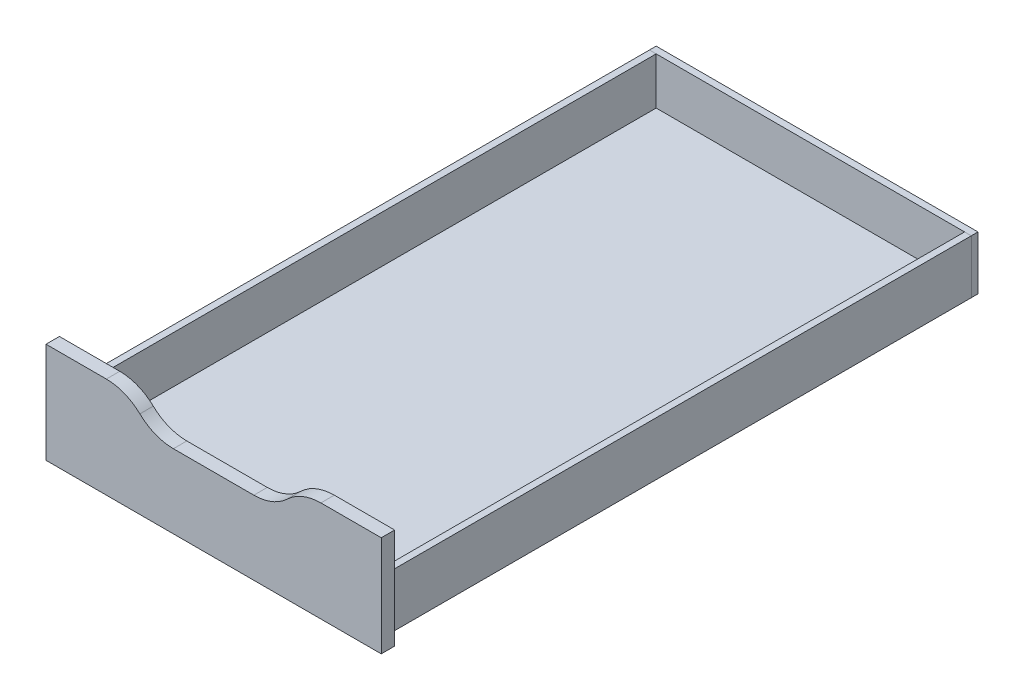
ISO-10303-21;
HEADER;
FILE_DESCRIPTION(('STEP AP214'),'2;1');
FILE_NAME('part.step','',(''),(''),'','','');
FILE_SCHEMA(('AUTOMOTIVE_DESIGN { 1 0 10303 214 1 1 1 1 }'));
ENDSEC;
DATA;
#1=APPLICATION_CONTEXT('core data for automotive mechanical design processes');
#2=APPLICATION_PROTOCOL_DEFINITION('international standard','automotive_design',2000,#1);
#3=PRODUCT_CONTEXT('',#1,'mechanical');
#4=PRODUCT('Part','Part','',(#3));
#5=PRODUCT_RELATED_PRODUCT_CATEGORY('part','',(#4));
#6=PRODUCT_DEFINITION_FORMATION('','',#4);
#7=PRODUCT_DEFINITION_CONTEXT('part definition',#1,'design');
#8=PRODUCT_DEFINITION('design','',#6,#7);
#9=PRODUCT_DEFINITION_SHAPE('','',#8);
#10=(LENGTH_UNIT() NAMED_UNIT(*) SI_UNIT(.MILLI.,.METRE.));
#11=(NAMED_UNIT(*) PLANE_ANGLE_UNIT() SI_UNIT($,.RADIAN.));
#12=(NAMED_UNIT(*) SI_UNIT($,.STERADIAN.) SOLID_ANGLE_UNIT());
#13=UNCERTAINTY_MEASURE_WITH_UNIT(LENGTH_MEASURE(1.E-05),#10,'distance_accuracy_value','');
#14=(GEOMETRIC_REPRESENTATION_CONTEXT(3) GLOBAL_UNCERTAINTY_ASSIGNED_CONTEXT((#13)) GLOBAL_UNIT_ASSIGNED_CONTEXT((#10,
#11,#12)) REPRESENTATION_CONTEXT('',''));
#15=CARTESIAN_POINT('',(0.,0.,0.));
#16=DIRECTION('',(0.,0.,1.));
#17=DIRECTION('',(1.,0.,0.));
#18=AXIS2_PLACEMENT_3D('',#15,#16,#17);
#19=CARTESIAN_POINT('',(152.4,0.,-279.4));
#20=DIRECTION('',(-1.,0.,0.));
#21=DIRECTION('',(0.,0.,1.));
#22=AXIS2_PLACEMENT_3D('',#19,#20,#21);
#23=PLANE('',#22);
#24=DIRECTION('',(0.,-1.,0.));
#25=VECTOR('',#24,1.);
#26=CARTESIAN_POINT('',(152.4,0.,-273.05));
#27=LINE('',#26,#25);
#28=CARTESIAN_POINT('',(152.4,50.8,-273.05));
#29=VERTEX_POINT('',#28);
#30=CARTESIAN_POINT('',(152.4,0.,-273.05));
#31=VERTEX_POINT('',#30);
#32=EDGE_CURVE('E121',#29,#31,#27,.T.);
#33=ORIENTED_EDGE('',*,*,#32,.T.);
#34=DIRECTION('',(0.,0.,1.));
#35=VECTOR('',#34,1.);
#36=CARTESIAN_POINT('',(152.4,0.,-279.4));
#37=LINE('',#36,#35);
#38=CARTESIAN_POINT('',(152.4,0.,-279.4));
#39=VERTEX_POINT('',#38);
#40=EDGE_CURVE('E12',#39,#31,#37,.T.);
#41=ORIENTED_EDGE('',*,*,#40,.F.);
#42=DIRECTION('',(0.,-1.,0.));
#43=VECTOR('',#42,1.);
#44=CARTESIAN_POINT('',(152.4,0.,-279.4));
#45=LINE('',#44,#43);
#46=CARTESIAN_POINT('',(152.4,50.8,-279.4));
#47=VERTEX_POINT('',#46);
#48=EDGE_CURVE('E109',#47,#39,#45,.T.);
#49=ORIENTED_EDGE('',*,*,#48,.F.);
#50=DIRECTION('',(0.,0.,1.));
#51=VECTOR('',#50,1.);
#52=CARTESIAN_POINT('',(152.4,50.8,-279.4));
#53=LINE('',#52,#51);
#54=EDGE_CURVE('E117',#47,#29,#53,.T.);
#55=ORIENTED_EDGE('',*,*,#54,.T.);
#56=EDGE_LOOP('',(#33,#41,#49,#55));
#57=FACE_BOUND('',#56,.T.);
#58=ADVANCED_FACE('F58',(#57),#23,.F.);
#59=CARTESIAN_POINT('',(152.4,0.,-279.4));
#60=DIRECTION('',(0.,1.,0.));
#61=DIRECTION('',(0.,0.,1.));
#62=AXIS2_PLACEMENT_3D('',#59,#60,#61);
#63=PLANE('',#62);
#64=DIRECTION('',(-1.,0.,0.));
#65=VECTOR('',#64,1.);
#66=CARTESIAN_POINT('',(152.4,0.,-273.05));
#67=LINE('',#66,#65);
#68=CARTESIAN_POINT('',(-152.4,0.,-273.05));
#69=VERTEX_POINT('',#68);
#70=EDGE_CURVE('E113',#31,#69,#67,.T.);
#71=ORIENTED_EDGE('',*,*,#70,.T.);
#72=DIRECTION('',(0.,0.,1.));
#73=VECTOR('',#72,1.);
#74=CARTESIAN_POINT('',(-152.4,0.,-279.4));
#75=LINE('',#74,#73);
#76=CARTESIAN_POINT('',(-152.4,0.,-279.4));
#77=VERTEX_POINT('',#76);
#78=EDGE_CURVE('E66',#77,#69,#75,.T.);
#79=ORIENTED_EDGE('',*,*,#78,.F.);
#80=DIRECTION('',(-1.,0.,0.));
#81=VECTOR('',#80,1.);
#82=CARTESIAN_POINT('',(152.4,0.,-279.4));
#83=LINE('',#82,#81);
#84=EDGE_CURVE('E104',#39,#77,#83,.T.);
#85=ORIENTED_EDGE('',*,*,#84,.F.);
#86=ORIENTED_EDGE('',*,*,#40,.T.);
#87=EDGE_LOOP('',(#71,#79,#85,#86));
#88=FACE_BOUND('',#87,.T.);
#89=ADVANCED_FACE('F112',(#88),#63,.F.);
#90=CARTESIAN_POINT('',(-152.4,0.,-279.4));
#91=DIRECTION('',(1.,0.,0.));
#92=DIRECTION('',(0.,0.,-1.));
#93=AXIS2_PLACEMENT_3D('',#90,#91,#92);
#94=PLANE('',#93);
#95=DIRECTION('',(0.,1.,0.));
#96=VECTOR('',#95,1.);
#97=CARTESIAN_POINT('',(-152.4,0.,-273.05));
#98=LINE('',#97,#96);
#99=CARTESIAN_POINT('',(-152.4,50.8,-273.05));
#100=VERTEX_POINT('',#99);
#101=EDGE_CURVE('E91',#69,#100,#98,.T.);
#102=ORIENTED_EDGE('',*,*,#101,.T.);
#103=DIRECTION('',(0.,0.,1.));
#104=VECTOR('',#103,1.);
#105=CARTESIAN_POINT('',(-152.4,50.8,-279.4));
#106=LINE('',#105,#104);
#107=CARTESIAN_POINT('',(-152.4,50.8,-279.4));
#108=VERTEX_POINT('',#107);
#109=EDGE_CURVE('E114',#108,#100,#106,.T.);
#110=ORIENTED_EDGE('',*,*,#109,.F.);
#111=DIRECTION('',(0.,1.,0.));
#112=VECTOR('',#111,1.);
#113=CARTESIAN_POINT('',(-152.4,0.,-279.4));
#114=LINE('',#113,#112);
#115=EDGE_CURVE('E107',#77,#108,#114,.T.);
#116=ORIENTED_EDGE('',*,*,#115,.F.);
#117=ORIENTED_EDGE('',*,*,#78,.T.);
#118=EDGE_LOOP('',(#102,#110,#116,#117));
#119=FACE_BOUND('',#118,.T.);
#120=ADVANCED_FACE('F115',(#119),#94,.F.);
#121=CARTESIAN_POINT('',(152.4,50.8,-279.4));
#122=DIRECTION('',(0.,-1.,0.));
#123=DIRECTION('',(0.,0.,-1.));
#124=AXIS2_PLACEMENT_3D('',#121,#122,#123);
#125=PLANE('',#124);
#126=DIRECTION('',(1.,0.,0.));
#127=VECTOR('',#126,1.);
#128=CARTESIAN_POINT('',(152.4,50.8,-273.05));
#129=LINE('',#128,#127);
#130=EDGE_CURVE('E97',#100,#29,#129,.T.);
#131=ORIENTED_EDGE('',*,*,#130,.T.);
#132=ORIENTED_EDGE('',*,*,#54,.F.);
#133=DIRECTION('',(1.,0.,0.));
#134=VECTOR('',#133,1.);
#135=CARTESIAN_POINT('',(152.4,50.8,-279.4));
#136=LINE('',#135,#134);
#137=EDGE_CURVE('E74',#108,#47,#136,.T.);
#138=ORIENTED_EDGE('',*,*,#137,.F.);
#139=ORIENTED_EDGE('',*,*,#109,.T.);
#140=EDGE_LOOP('',(#131,#132,#138,#139));
#141=FACE_BOUND('',#140,.T.);
#142=ADVANCED_FACE('F128',(#141),#125,.F.);
#143=CARTESIAN_POINT('',(0.,0.,-279.4));
#144=DIRECTION('',(0.,0.,1.));
#145=DIRECTION('',(1.,0.,0.));
#146=AXIS2_PLACEMENT_3D('',#143,#144,#145);
#147=PLANE('',#146);
#148=ORIENTED_EDGE('',*,*,#48,.T.);
#149=ORIENTED_EDGE('',*,*,#84,.T.);
#150=ORIENTED_EDGE('',*,*,#115,.T.);
#151=ORIENTED_EDGE('',*,*,#137,.T.);
#152=EDGE_LOOP('',(#148,#149,#150,#151));
#153=FACE_BOUND('',#152,.T.);
#154=ADVANCED_FACE('F105',(#153),#147,.F.);
#155=CARTESIAN_POINT('',(0.,0.,-273.05));
#156=DIRECTION('',(0.,0.,1.));
#157=DIRECTION('',(1.,0.,0.));
#158=AXIS2_PLACEMENT_3D('',#155,#156,#157);
#159=PLANE('',#158);
#160=ORIENTED_EDGE('',*,*,#32,.F.);
#161=ORIENTED_EDGE('',*,*,#130,.F.);
#162=ORIENTED_EDGE('',*,*,#101,.F.);
#163=ORIENTED_EDGE('',*,*,#70,.F.);
#164=EDGE_LOOP('',(#160,#161,#162,#163));
#165=FACE_BOUND('',#164,.T.);
#166=ADVANCED_FACE('F131',(#165),#159,.T.);
#167=CLOSED_SHELL('',(#58,#89,#120,#142,#154,#166));
#168=MANIFOLD_SOLID_BREP('B2',#167);
#169=CARTESIAN_POINT('',(-152.4,0.,279.4));
#170=DIRECTION('',(0.,0.,-1.));
#171=DIRECTION('',(0.,1.,0.));
#172=AXIS2_PLACEMENT_3D('',#169,#170,#171);
#173=PLANE('',#172);
#174=DIRECTION('',(0.,-1.,0.));
#175=VECTOR('',#174,1.);
#176=CARTESIAN_POINT('',(-146.05,0.,279.4));
#177=LINE('',#176,#175);
#178=CARTESIAN_POINT('',(-146.05,50.8,279.4));
#179=VERTEX_POINT('',#178);
#180=CARTESIAN_POINT('',(-146.05,0.,279.4));
#181=VERTEX_POINT('',#180);
#182=EDGE_CURVE('E267',#179,#181,#177,.T.);
#183=ORIENTED_EDGE('',*,*,#182,.F.);
#184=DIRECTION('',(1.,0.,0.));
#185=VECTOR('',#184,1.);
#186=CARTESIAN_POINT('',(-152.4,50.8,279.4));
#187=LINE('',#186,#185);
#188=CARTESIAN_POINT('',(-152.4,50.8,279.4));
#189=VERTEX_POINT('',#188);
#190=EDGE_CURVE('E266',#189,#179,#187,.T.);
#191=ORIENTED_EDGE('',*,*,#190,.F.);
#192=DIRECTION('',(0.,-1.,0.));
#193=VECTOR('',#192,1.);
#194=CARTESIAN_POINT('',(-152.4,0.,279.4));
#195=LINE('',#194,#193);
#196=CARTESIAN_POINT('',(-152.4,0.,279.4));
#197=VERTEX_POINT('',#196);
#198=EDGE_CURVE('E261',#189,#197,#195,.T.);
#199=ORIENTED_EDGE('',*,*,#198,.T.);
#200=DIRECTION('',(1.,0.,0.));
#201=VECTOR('',#200,1.);
#202=CARTESIAN_POINT('',(-152.4,0.,279.4));
#203=LINE('',#202,#201);
#204=EDGE_CURVE('E56',#197,#181,#203,.T.);
#205=ORIENTED_EDGE('',*,*,#204,.T.);
#206=EDGE_LOOP('',(#183,#191,#199,#205));
#207=FACE_BOUND('',#206,.T.);
#208=ADVANCED_FACE('F204',(#207),#173,.F.);
#209=CARTESIAN_POINT('',(-152.4,0.,279.4));
#210=DIRECTION('',(0.,1.,0.));
#211=DIRECTION('',(0.,0.,1.));
#212=AXIS2_PLACEMENT_3D('',#209,#210,#211);
#213=PLANE('',#212);
#214=DIRECTION('',(0.,0.,-1.));
#215=VECTOR('',#214,1.);
#216=CARTESIAN_POINT('',(-146.05,0.,279.4));
#217=LINE('',#216,#215);
#218=CARTESIAN_POINT('',(-146.05,0.,-273.05));
#219=VERTEX_POINT('',#218);
#220=EDGE_CURVE('E269',#181,#219,#217,.T.);
#221=ORIENTED_EDGE('',*,*,#220,.F.);
#222=ORIENTED_EDGE('',*,*,#204,.F.);
#223=DIRECTION('',(0.,0.,-1.));
#224=VECTOR('',#223,1.);
#225=CARTESIAN_POINT('',(-152.4,0.,279.4));
#226=LINE('',#225,#224);
#227=CARTESIAN_POINT('',(-152.4,0.,-273.05));
#228=VERTEX_POINT('',#227);
#229=EDGE_CURVE('E245',#197,#228,#226,.T.);
#230=ORIENTED_EDGE('',*,*,#229,.T.);
#231=DIRECTION('',(1.,0.,0.));
#232=VECTOR('',#231,1.);
#233=CARTESIAN_POINT('',(-152.4,0.,-273.05));
#234=LINE('',#233,#232);
#235=EDGE_CURVE('E212',#228,#219,#234,.T.);
#236=ORIENTED_EDGE('',*,*,#235,.T.);
#237=EDGE_LOOP('',(#221,#222,#230,#236));
#238=FACE_BOUND('',#237,.T.);
#239=ADVANCED_FACE('F259',(#238),#213,.F.);
#240=CARTESIAN_POINT('',(-152.4,0.,-273.05));
#241=DIRECTION('',(0.,0.,1.));
#242=DIRECTION('',(0.,-1.,0.));
#243=AXIS2_PLACEMENT_3D('',#240,#241,#242);
#244=PLANE('',#243);
#245=DIRECTION('',(0.,1.,0.));
#246=VECTOR('',#245,1.);
#247=CARTESIAN_POINT('',(-146.05,0.,-273.05));
#248=LINE('',#247,#246);
#249=CARTESIAN_POINT('',(-146.05,50.8,-273.05));
#250=VERTEX_POINT('',#249);
#251=EDGE_CURVE('E255',#219,#250,#248,.T.);
#252=ORIENTED_EDGE('',*,*,#251,.F.);
#253=ORIENTED_EDGE('',*,*,#235,.F.);
#254=DIRECTION('',(0.,1.,0.));
#255=VECTOR('',#254,1.);
#256=CARTESIAN_POINT('',(-152.4,0.,-273.05));
#257=LINE('',#256,#255);
#258=CARTESIAN_POINT('',(-152.4,50.8,-273.05));
#259=VERTEX_POINT('',#258);
#260=EDGE_CURVE('E248',#228,#259,#257,.T.);
#261=ORIENTED_EDGE('',*,*,#260,.T.);
#262=DIRECTION('',(1.,0.,0.));
#263=VECTOR('',#262,1.);
#264=CARTESIAN_POINT('',(-152.4,50.8,-273.05));
#265=LINE('',#264,#263);
#266=EDGE_CURVE('E258',#259,#250,#265,.T.);
#267=ORIENTED_EDGE('',*,*,#266,.T.);
#268=EDGE_LOOP('',(#252,#253,#261,#267));
#269=FACE_BOUND('',#268,.T.);
#270=ADVANCED_FACE('F254',(#269),#244,.F.);
#271=CARTESIAN_POINT('',(-152.4,50.8,279.4));
#272=DIRECTION('',(0.,-1.,0.));
#273=DIRECTION('',(0.,0.,-1.));
#274=AXIS2_PLACEMENT_3D('',#271,#272,#273);
#275=PLANE('',#274);
#276=DIRECTION('',(0.,0.,1.));
#277=VECTOR('',#276,1.);
#278=CARTESIAN_POINT('',(-146.05,50.8,279.4));
#279=LINE('',#278,#277);
#280=EDGE_CURVE('E234',#250,#179,#279,.T.);
#281=ORIENTED_EDGE('',*,*,#280,.F.);
#282=ORIENTED_EDGE('',*,*,#266,.F.);
#283=DIRECTION('',(0.,0.,1.));
#284=VECTOR('',#283,1.);
#285=CARTESIAN_POINT('',(-152.4,50.8,279.4));
#286=LINE('',#285,#284);
#287=EDGE_CURVE('E220',#259,#189,#286,.T.);
#288=ORIENTED_EDGE('',*,*,#287,.T.);
#289=ORIENTED_EDGE('',*,*,#190,.T.);
#290=EDGE_LOOP('',(#281,#282,#288,#289));
#291=FACE_BOUND('',#290,.T.);
#292=ADVANCED_FACE('F278',(#291),#275,.F.);
#293=CARTESIAN_POINT('',(-152.4,0.,0.));
#294=DIRECTION('',(1.,0.,0.));
#295=DIRECTION('',(0.,0.,1.));
#296=AXIS2_PLACEMENT_3D('',#293,#294,#295);
#297=PLANE('',#296);
#298=ORIENTED_EDGE('',*,*,#198,.F.);
#299=ORIENTED_EDGE('',*,*,#287,.F.);
#300=ORIENTED_EDGE('',*,*,#260,.F.);
#301=ORIENTED_EDGE('',*,*,#229,.F.);
#302=EDGE_LOOP('',(#298,#299,#300,#301));
#303=FACE_BOUND('',#302,.T.);
#304=ADVANCED_FACE('F250',(#303),#297,.F.);
#305=CARTESIAN_POINT('',(-146.05,0.,0.));
#306=DIRECTION('',(1.,0.,0.));
#307=DIRECTION('',(0.,0.,1.));
#308=AXIS2_PLACEMENT_3D('',#305,#306,#307);
#309=PLANE('',#308);
#310=ORIENTED_EDGE('',*,*,#182,.T.);
#311=ORIENTED_EDGE('',*,*,#220,.T.);
#312=ORIENTED_EDGE('',*,*,#251,.T.);
#313=ORIENTED_EDGE('',*,*,#280,.T.);
#314=EDGE_LOOP('',(#310,#311,#312,#313));
#315=FACE_BOUND('',#314,.T.);
#316=ADVANCED_FACE('F274',(#315),#309,.T.);
#317=CLOSED_SHELL('',(#208,#239,#270,#292,#304,#316));
#318=MANIFOLD_SOLID_BREP('B6',#317);
#319=CARTESIAN_POINT('',(152.4,0.,279.4));
#320=DIRECTION('',(0.,0.,-1.));
#321=DIRECTION('',(0.,1.,0.));
#322=AXIS2_PLACEMENT_3D('',#319,#320,#321);
#323=PLANE('',#322);
#324=DIRECTION('',(0.,-1.,0.));
#325=VECTOR('',#324,1.);
#326=CARTESIAN_POINT('',(146.05,0.,279.4));
#327=LINE('',#326,#325);
#328=CARTESIAN_POINT('',(146.05,50.8,279.4));
#329=VERTEX_POINT('',#328);
#330=CARTESIAN_POINT('',(146.05,0.,279.4));
#331=VERTEX_POINT('',#330);
#332=EDGE_CURVE('E413',#329,#331,#327,.T.);
#333=ORIENTED_EDGE('',*,*,#332,.T.);
#334=DIRECTION('',(-1.,0.,0.));
#335=VECTOR('',#334,1.);
#336=CARTESIAN_POINT('',(152.4,0.,279.4));
#337=LINE('',#336,#335);
#338=CARTESIAN_POINT('',(152.4,0.,279.4));
#339=VERTEX_POINT('',#338);
#340=EDGE_CURVE('E202',#339,#331,#337,.T.);
#341=ORIENTED_EDGE('',*,*,#340,.F.);
#342=DIRECTION('',(0.,-1.,0.));
#343=VECTOR('',#342,1.);
#344=CARTESIAN_POINT('',(152.4,0.,279.4));
#345=LINE('',#344,#343);
#346=CARTESIAN_POINT('',(152.4,50.8,279.4));
#347=VERTEX_POINT('',#346);
#348=EDGE_CURVE('E401',#347,#339,#345,.T.);
#349=ORIENTED_EDGE('',*,*,#348,.F.);
#350=DIRECTION('',(-1.,0.,0.));
#351=VECTOR('',#350,1.);
#352=CARTESIAN_POINT('',(152.4,50.8,279.4));
#353=LINE('',#352,#351);
#354=EDGE_CURVE('E409',#347,#329,#353,.T.);
#355=ORIENTED_EDGE('',*,*,#354,.T.);
#356=EDGE_LOOP('',(#333,#341,#349,#355));
#357=FACE_BOUND('',#356,.T.);
#358=ADVANCED_FACE('F350',(#357),#323,.F.);
#359=CARTESIAN_POINT('',(152.4,0.,279.4));
#360=DIRECTION('',(0.,1.,0.));
#361=DIRECTION('',(0.,0.,1.));
#362=AXIS2_PLACEMENT_3D('',#359,#360,#361);
#363=PLANE('',#362);
#364=DIRECTION('',(0.,0.,-1.));
#365=VECTOR('',#364,1.);
#366=CARTESIAN_POINT('',(146.05,0.,279.4));
#367=LINE('',#366,#365);
#368=CARTESIAN_POINT('',(146.05,0.,-273.05));
#369=VERTEX_POINT('',#368);
#370=EDGE_CURVE('E405',#331,#369,#367,.T.);
#371=ORIENTED_EDGE('',*,*,#370,.T.);
#372=DIRECTION('',(-1.,0.,0.));
#373=VECTOR('',#372,1.);
#374=CARTESIAN_POINT('',(152.4,0.,-273.05));
#375=LINE('',#374,#373);
#376=CARTESIAN_POINT('',(152.4,0.,-273.05));
#377=VERTEX_POINT('',#376);
#378=EDGE_CURVE('E358',#377,#369,#375,.T.);
#379=ORIENTED_EDGE('',*,*,#378,.F.);
#380=DIRECTION('',(0.,0.,-1.));
#381=VECTOR('',#380,1.);
#382=CARTESIAN_POINT('',(152.4,0.,279.4));
#383=LINE('',#382,#381);
#384=EDGE_CURVE('E396',#339,#377,#383,.T.);
#385=ORIENTED_EDGE('',*,*,#384,.F.);
#386=ORIENTED_EDGE('',*,*,#340,.T.);
#387=EDGE_LOOP('',(#371,#379,#385,#386));
#388=FACE_BOUND('',#387,.T.);
#389=ADVANCED_FACE('F404',(#388),#363,.F.);
#390=CARTESIAN_POINT('',(152.4,0.,-273.05));
#391=DIRECTION('',(0.,0.,1.));
#392=DIRECTION('',(0.,-1.,0.));
#393=AXIS2_PLACEMENT_3D('',#390,#391,#392);
#394=PLANE('',#393);
#395=DIRECTION('',(0.,1.,0.));
#396=VECTOR('',#395,1.);
#397=CARTESIAN_POINT('',(146.05,0.,-273.05));
#398=LINE('',#397,#396);
#399=CARTESIAN_POINT('',(146.05,50.8,-273.05));
#400=VERTEX_POINT('',#399);
#401=EDGE_CURVE('E383',#369,#400,#398,.T.);
#402=ORIENTED_EDGE('',*,*,#401,.T.);
#403=DIRECTION('',(-1.,0.,0.));
#404=VECTOR('',#403,1.);
#405=CARTESIAN_POINT('',(152.4,50.8,-273.05));
#406=LINE('',#405,#404);
#407=CARTESIAN_POINT('',(152.4,50.8,-273.05));
#408=VERTEX_POINT('',#407);
#409=EDGE_CURVE('E406',#408,#400,#406,.T.);
#410=ORIENTED_EDGE('',*,*,#409,.F.);
#411=DIRECTION('',(0.,1.,0.));
#412=VECTOR('',#411,1.);
#413=CARTESIAN_POINT('',(152.4,0.,-273.05));
#414=LINE('',#413,#412);
#415=EDGE_CURVE('E399',#377,#408,#414,.T.);
#416=ORIENTED_EDGE('',*,*,#415,.F.);
#417=ORIENTED_EDGE('',*,*,#378,.T.);
#418=EDGE_LOOP('',(#402,#410,#416,#417));
#419=FACE_BOUND('',#418,.T.);
#420=ADVANCED_FACE('F407',(#419),#394,.F.);
#421=CARTESIAN_POINT('',(152.4,50.8,279.4));
#422=DIRECTION('',(0.,-1.,0.));
#423=DIRECTION('',(0.,0.,-1.));
#424=AXIS2_PLACEMENT_3D('',#421,#422,#423);
#425=PLANE('',#424);
#426=DIRECTION('',(0.,0.,1.));
#427=VECTOR('',#426,1.);
#428=CARTESIAN_POINT('',(146.05,50.8,279.4));
#429=LINE('',#428,#427);
#430=EDGE_CURVE('E389',#400,#329,#429,.T.);
#431=ORIENTED_EDGE('',*,*,#430,.T.);
#432=ORIENTED_EDGE('',*,*,#354,.F.);
#433=DIRECTION('',(0.,0.,1.));
#434=VECTOR('',#433,1.);
#435=CARTESIAN_POINT('',(152.4,50.8,279.4));
#436=LINE('',#435,#434);
#437=EDGE_CURVE('E366',#408,#347,#436,.T.);
#438=ORIENTED_EDGE('',*,*,#437,.F.);
#439=ORIENTED_EDGE('',*,*,#409,.T.);
#440=EDGE_LOOP('',(#431,#432,#438,#439));
#441=FACE_BOUND('',#440,.T.);
#442=ADVANCED_FACE('F420',(#441),#425,.F.);
#443=CARTESIAN_POINT('',(152.4,0.,0.));
#444=DIRECTION('',(-1.,0.,0.));
#445=DIRECTION('',(0.,0.,1.));
#446=AXIS2_PLACEMENT_3D('',#443,#444,#445);
#447=PLANE('',#446);
#448=ORIENTED_EDGE('',*,*,#348,.T.);
#449=ORIENTED_EDGE('',*,*,#384,.T.);
#450=ORIENTED_EDGE('',*,*,#415,.T.);
#451=ORIENTED_EDGE('',*,*,#437,.T.);
#452=EDGE_LOOP('',(#448,#449,#450,#451));
#453=FACE_BOUND('',#452,.T.);
#454=ADVANCED_FACE('F397',(#453),#447,.F.);
#455=CARTESIAN_POINT('',(146.05,0.,0.));
#456=DIRECTION('',(-1.,0.,0.));
#457=DIRECTION('',(0.,0.,1.));
#458=AXIS2_PLACEMENT_3D('',#455,#456,#457);
#459=PLANE('',#458);
#460=ORIENTED_EDGE('',*,*,#332,.F.);
#461=ORIENTED_EDGE('',*,*,#430,.F.);
#462=ORIENTED_EDGE('',*,*,#401,.F.);
#463=ORIENTED_EDGE('',*,*,#370,.F.);
#464=EDGE_LOOP('',(#460,#461,#462,#463));
#465=FACE_BOUND('',#464,.T.);
#466=ADVANCED_FACE('F423',(#465),#459,.T.);
#467=CLOSED_SHELL('',(#358,#389,#420,#442,#454,#466));
#468=MANIFOLD_SOLID_BREP('B50',#467);
#469=CARTESIAN_POINT('',(-158.75,88.9,292.1));
#470=DIRECTION('',(0.,-1.,0.));
#471=DIRECTION('',(0.,0.,-1.));
#472=AXIS2_PLACEMENT_3D('',#469,#470,#471);
#473=PLANE('',#472);
#474=DIRECTION('',(0.,0.,1.));
#475=VECTOR('',#474,1.);
#476=CARTESIAN_POINT('',(101.6,88.9,-273.05));
#477=LINE('',#476,#475);
#478=CARTESIAN_POINT('',(101.6,88.9,279.4));
#479=VERTEX_POINT('',#478);
#480=CARTESIAN_POINT('',(101.6,88.9,292.1));
#481=VERTEX_POINT('',#480);
#482=EDGE_CURVE('E606',#479,#481,#477,.T.);
#483=ORIENTED_EDGE('',*,*,#482,.T.);
#484=DIRECTION('',(-1.,0.,0.));
#485=VECTOR('',#484,1.);
#486=CARTESIAN_POINT('',(-158.75,88.9,292.1));
#487=LINE('',#486,#485);
#488=CARTESIAN_POINT('',(158.75,88.9,292.1));
#489=VERTEX_POINT('',#488);
#490=EDGE_CURVE('E596',#489,#481,#487,.T.);
#491=ORIENTED_EDGE('',*,*,#490,.F.);
#492=DIRECTION('',(0.,0.,-1.));
#493=VECTOR('',#492,1.);
#494=CARTESIAN_POINT('',(158.75,88.9,292.1));
#495=LINE('',#494,#493);
#496=CARTESIAN_POINT('',(158.75,88.9,279.4));
#497=VERTEX_POINT('',#496);
#498=EDGE_CURVE('E615',#489,#497,#495,.T.);
#499=ORIENTED_EDGE('',*,*,#498,.T.);
#500=DIRECTION('',(-1.,0.,0.));
#501=VECTOR('',#500,1.);
#502=CARTESIAN_POINT('',(-158.75,88.9,279.4));
#503=LINE('',#502,#501);
#504=EDGE_CURVE('E610',#497,#479,#503,.T.);
#505=ORIENTED_EDGE('',*,*,#504,.T.);
#506=EDGE_LOOP('',(#483,#491,#499,#505));
#507=FACE_BOUND('',#506,.T.);
#508=ADVANCED_FACE('F495',(#507),#473,.F.);
#509=CARTESIAN_POINT('',(0.,0.,292.1));
#510=DIRECTION('',(0.,0.,-1.));
#511=DIRECTION('',(-1.,0.,0.));
#512=AXIS2_PLACEMENT_3D('',#509,#510,#511);
#513=PLANE('',#512);
#514=ORIENTED_EDGE('',*,*,#490,.T.);
#515=CARTESIAN_POINT('',(101.6,42.8625,292.1));
#516=DIRECTION('',(0.,0.,-1.));
#517=DIRECTION('',(1.,0.,0.));
#518=AXIS2_PLACEMENT_3D('',#515,#516,#517);
#519=CIRCLE('',#518,46.0375);
#520=CARTESIAN_POINT('',(69.85,76.2,292.1));
#521=VERTEX_POINT('',#520);
#522=EDGE_CURVE('E585',#521,#481,#519,.T.);
#523=ORIENTED_EDGE('',*,*,#522,.F.);
#524=CARTESIAN_POINT('',(38.1,109.5375,292.1));
#525=DIRECTION('',(0.,0.,1.));
#526=DIRECTION('',(-1.,0.,0.));
#527=AXIS2_PLACEMENT_3D('',#524,#525,#526);
#528=CIRCLE('',#527,46.0375);
#529=CARTESIAN_POINT('',(38.1,63.5,292.1));
#530=VERTEX_POINT('',#529);
#531=EDGE_CURVE('E666',#530,#521,#528,.T.);
#532=ORIENTED_EDGE('',*,*,#531,.F.);
#533=DIRECTION('',(1.,0.,0.));
#534=VECTOR('',#533,1.);
#535=CARTESIAN_POINT('',(38.1,63.5,292.1));
#536=LINE('',#535,#534);
#537=CARTESIAN_POINT('',(-38.1,63.5,292.1));
#538=VERTEX_POINT('',#537);
#539=EDGE_CURVE('E642',#538,#530,#536,.T.);
#540=ORIENTED_EDGE('',*,*,#539,.F.);
#541=CARTESIAN_POINT('',(-38.1,109.5375,292.1));
#542=DIRECTION('',(0.,0.,1.));
#543=DIRECTION('',(-1.,0.,0.));
#544=AXIS2_PLACEMENT_3D('',#541,#542,#543);
#545=CIRCLE('',#544,46.0375);
#546=CARTESIAN_POINT('',(-69.85,76.2,292.1));
#547=VERTEX_POINT('',#546);
#548=EDGE_CURVE('E591',#547,#538,#545,.T.);
#549=ORIENTED_EDGE('',*,*,#548,.F.);
#550=CARTESIAN_POINT('',(-101.6,42.8625,292.1));
#551=DIRECTION('',(0.,0.,-1.));
#552=DIRECTION('',(1.,0.,0.));
#553=AXIS2_PLACEMENT_3D('',#550,#551,#552);
#554=CIRCLE('',#553,46.0375);
#555=CARTESIAN_POINT('',(-101.6,88.9,292.1));
#556=VERTEX_POINT('',#555);
#557=EDGE_CURVE('E581',#556,#547,#554,.T.);
#558=ORIENTED_EDGE('',*,*,#557,.F.);
#559=CARTESIAN_POINT('',(-158.75,88.9,292.1));
#560=VERTEX_POINT('',#559);
#561=EDGE_CURVE('E519',#556,#560,#487,.T.);
#562=ORIENTED_EDGE('',*,*,#561,.T.);
#563=DIRECTION('',(0.,-1.,0.));
#564=VECTOR('',#563,1.);
#565=CARTESIAN_POINT('',(-158.75,-6.35,292.1));
#566=LINE('',#565,#564);
#567=CARTESIAN_POINT('',(-158.75,-6.35,292.1));
#568=VERTEX_POINT('',#567);
#569=EDGE_CURVE('E613',#560,#568,#566,.T.);
#570=ORIENTED_EDGE('',*,*,#569,.T.);
#571=DIRECTION('',(1.,0.,0.));
#572=VECTOR('',#571,1.);
#573=CARTESIAN_POINT('',(-158.75,-6.35,292.1));
#574=LINE('',#573,#572);
#575=CARTESIAN_POINT('',(158.75,-6.35,292.1));
#576=VERTEX_POINT('',#575);
#577=EDGE_CURVE('E549',#568,#576,#574,.T.);
#578=ORIENTED_EDGE('',*,*,#577,.T.);
#579=DIRECTION('',(0.,1.,0.));
#580=VECTOR('',#579,1.);
#581=CARTESIAN_POINT('',(158.75,-6.35,292.1));
#582=LINE('',#581,#580);
#583=EDGE_CURVE('E597',#576,#489,#582,.T.);
#584=ORIENTED_EDGE('',*,*,#583,.T.);
#585=EDGE_LOOP('',(#514,#523,#532,#540,#549,#558,#562,#570,#578,#584));
#586=FACE_BOUND('',#585,.T.);
#587=ADVANCED_FACE('F588',(#586),#513,.F.);
#588=CARTESIAN_POINT('',(0.,0.,279.4));
#589=DIRECTION('',(0.,0.,-1.));
#590=DIRECTION('',(-1.,0.,0.));
#591=AXIS2_PLACEMENT_3D('',#588,#589,#590);
#592=PLANE('',#591);
#593=CARTESIAN_POINT('',(101.6,42.8625,279.4));
#594=DIRECTION('',(0.,0.,-1.));
#595=DIRECTION('',(-1.,0.,0.));
#596=AXIS2_PLACEMENT_3D('',#593,#594,#595);
#597=CIRCLE('',#596,46.0375);
#598=CARTESIAN_POINT('',(69.85,76.2,279.4));
#599=VERTEX_POINT('',#598);
#600=EDGE_CURVE('E348',#479,#599,#597,.F.);
#601=ORIENTED_EDGE('',*,*,#600,.F.);
#602=ORIENTED_EDGE('',*,*,#504,.F.);
#603=DIRECTION('',(0.,1.,0.));
#604=VECTOR('',#603,1.);
#605=CARTESIAN_POINT('',(158.75,-6.35,279.4));
#606=LINE('',#605,#604);
#607=CARTESIAN_POINT('',(158.75,-6.35,279.4));
#608=VERTEX_POINT('',#607);
#609=EDGE_CURVE('E608',#608,#497,#606,.T.);
#610=ORIENTED_EDGE('',*,*,#609,.F.);
#611=DIRECTION('',(1.,0.,0.));
#612=VECTOR('',#611,1.);
#613=CARTESIAN_POINT('',(-158.75,-6.35,279.4));
#614=LINE('',#613,#612);
#615=CARTESIAN_POINT('',(-158.75,-6.35,279.4));
#616=VERTEX_POINT('',#615);
#617=EDGE_CURVE('E605',#616,#608,#614,.T.);
#618=ORIENTED_EDGE('',*,*,#617,.F.);
#619=DIRECTION('',(0.,-1.,0.));
#620=VECTOR('',#619,1.);
#621=CARTESIAN_POINT('',(-158.75,-6.35,279.4));
#622=LINE('',#621,#620);
#623=CARTESIAN_POINT('',(-158.75,88.9,279.4));
#624=VERTEX_POINT('',#623);
#625=EDGE_CURVE('E602',#624,#616,#622,.T.);
#626=ORIENTED_EDGE('',*,*,#625,.F.);
#627=CARTESIAN_POINT('',(-101.6,88.9,279.4));
#628=VERTEX_POINT('',#627);
#629=EDGE_CURVE('E541',#628,#624,#503,.T.);
#630=ORIENTED_EDGE('',*,*,#629,.F.);
#631=CARTESIAN_POINT('',(-101.6,42.8625,279.4));
#632=DIRECTION('',(0.,0.,-1.));
#633=DIRECTION('',(-1.,0.,0.));
#634=AXIS2_PLACEMENT_3D('',#631,#632,#633);
#635=CIRCLE('',#634,46.0375);
#636=CARTESIAN_POINT('',(-69.85,76.2,279.4));
#637=VERTEX_POINT('',#636);
#638=EDGE_CURVE('E584',#637,#628,#635,.F.);
#639=ORIENTED_EDGE('',*,*,#638,.F.);
#640=CARTESIAN_POINT('',(-38.1,109.5375,279.4));
#641=DIRECTION('',(0.,0.,-1.));
#642=DIRECTION('',(-1.,0.,0.));
#643=AXIS2_PLACEMENT_3D('',#640,#641,#642);
#644=CIRCLE('',#643,46.0375);
#645=CARTESIAN_POINT('',(-38.1,63.5,279.4));
#646=VERTEX_POINT('',#645);
#647=EDGE_CURVE('E624',#646,#637,#644,.T.);
#648=ORIENTED_EDGE('',*,*,#647,.F.);
#649=DIRECTION('',(-1.,0.,0.));
#650=VECTOR('',#649,1.);
#651=CARTESIAN_POINT('',(0.,63.5,279.4));
#652=LINE('',#651,#650);
#653=CARTESIAN_POINT('',(38.1,63.5,279.4));
#654=VERTEX_POINT('',#653);
#655=EDGE_CURVE('E626',#654,#646,#652,.T.);
#656=ORIENTED_EDGE('',*,*,#655,.F.);
#657=CARTESIAN_POINT('',(38.1,109.5375,279.4));
#658=DIRECTION('',(0.,0.,-1.));
#659=DIRECTION('',(-1.,0.,0.));
#660=AXIS2_PLACEMENT_3D('',#657,#658,#659);
#661=CIRCLE('',#660,46.0375);
#662=EDGE_CURVE('E503',#599,#654,#661,.T.);
#663=ORIENTED_EDGE('',*,*,#662,.F.);
#664=EDGE_LOOP('',(#601,#602,#610,#618,#626,#630,#639,#648,#656,#663));
#665=FACE_BOUND('',#664,.T.);
#666=ADVANCED_FACE('F647',(#665),#592,.T.);
#667=CARTESIAN_POINT('',(-158.75,-6.35,292.1));
#668=DIRECTION('',(1.,0.,0.));
#669=DIRECTION('',(0.,0.,-1.));
#670=AXIS2_PLACEMENT_3D('',#667,#668,#669);
#671=PLANE('',#670);
#672=ORIENTED_EDGE('',*,*,#625,.T.);
#673=DIRECTION('',(0.,0.,-1.));
#674=VECTOR('',#673,1.);
#675=CARTESIAN_POINT('',(-158.75,-6.35,292.1));
#676=LINE('',#675,#674);
#677=EDGE_CURVE('E621',#568,#616,#676,.T.);
#678=ORIENTED_EDGE('',*,*,#677,.F.);
#679=ORIENTED_EDGE('',*,*,#569,.F.);
#680=DIRECTION('',(0.,0.,-1.));
#681=VECTOR('',#680,1.);
#682=CARTESIAN_POINT('',(-158.75,88.9,292.1));
#683=LINE('',#682,#681);
#684=EDGE_CURVE('E594',#560,#624,#683,.T.);
#685=ORIENTED_EDGE('',*,*,#684,.T.);
#686=EDGE_LOOP('',(#672,#678,#679,#685));
#687=FACE_BOUND('',#686,.T.);
#688=ADVANCED_FACE('F497',(#687),#671,.F.);
#689=CARTESIAN_POINT('',(-158.75,-6.35,292.1));
#690=DIRECTION('',(0.,1.,0.));
#691=DIRECTION('',(0.,0.,1.));
#692=AXIS2_PLACEMENT_3D('',#689,#690,#691);
#693=PLANE('',#692);
#694=ORIENTED_EDGE('',*,*,#617,.T.);
#695=DIRECTION('',(0.,0.,-1.));
#696=VECTOR('',#695,1.);
#697=CARTESIAN_POINT('',(158.75,-6.35,292.1));
#698=LINE('',#697,#696);
#699=EDGE_CURVE('E618',#576,#608,#698,.T.);
#700=ORIENTED_EDGE('',*,*,#699,.F.);
#701=ORIENTED_EDGE('',*,*,#577,.F.);
#702=ORIENTED_EDGE('',*,*,#677,.T.);
#703=EDGE_LOOP('',(#694,#700,#701,#702));
#704=FACE_BOUND('',#703,.T.);
#705=ADVANCED_FACE('F657',(#704),#693,.F.);
#706=CARTESIAN_POINT('',(158.75,-6.35,292.1));
#707=DIRECTION('',(-1.,0.,0.));
#708=DIRECTION('',(0.,0.,1.));
#709=AXIS2_PLACEMENT_3D('',#706,#707,#708);
#710=PLANE('',#709);
#711=ORIENTED_EDGE('',*,*,#609,.T.);
#712=ORIENTED_EDGE('',*,*,#498,.F.);
#713=ORIENTED_EDGE('',*,*,#583,.F.);
#714=ORIENTED_EDGE('',*,*,#699,.T.);
#715=EDGE_LOOP('',(#711,#712,#713,#714));
#716=FACE_BOUND('',#715,.T.);
#717=ADVANCED_FACE('F660',(#716),#710,.F.);
#718=ORIENTED_EDGE('',*,*,#561,.F.);
#719=DIRECTION('',(0.,0.,1.));
#720=VECTOR('',#719,1.);
#721=CARTESIAN_POINT('',(-101.6,88.9,-273.05));
#722=LINE('',#721,#720);
#723=EDGE_CURVE('E579',#628,#556,#722,.T.);
#724=ORIENTED_EDGE('',*,*,#723,.F.);
#725=ORIENTED_EDGE('',*,*,#629,.T.);
#726=ORIENTED_EDGE('',*,*,#684,.F.);
#727=EDGE_LOOP('',(#718,#724,#725,#726));
#728=FACE_BOUND('',#727,.T.);
#729=ADVANCED_FACE('F593',(#728),#473,.F.);
#730=CARTESIAN_POINT('',(101.6,42.8625,-273.05));
#731=DIRECTION('',(0.,0.,1.));
#732=DIRECTION('',(1.,0.,0.));
#733=AXIS2_PLACEMENT_3D('',#730,#731,#732);
#734=CYLINDRICAL_SURFACE('',#733,46.0375);
#735=ORIENTED_EDGE('',*,*,#600,.T.);
#736=DIRECTION('',(0.,0.,1.));
#737=VECTOR('',#736,1.);
#738=CARTESIAN_POINT('',(69.85,76.2,-273.05));
#739=LINE('',#738,#737);
#740=EDGE_CURVE('E635',#599,#521,#739,.T.);
#741=ORIENTED_EDGE('',*,*,#740,.T.);
#742=ORIENTED_EDGE('',*,*,#522,.T.);
#743=ORIENTED_EDGE('',*,*,#482,.F.);
#744=EDGE_LOOP('',(#735,#741,#742,#743));
#745=FACE_BOUND('',#744,.T.);
#746=ADVANCED_FACE('F672',(#745),#734,.T.);
#747=CARTESIAN_POINT('',(38.1,109.5375,-273.05));
#748=DIRECTION('',(0.,0.,1.));
#749=DIRECTION('',(1.,0.,0.));
#750=AXIS2_PLACEMENT_3D('',#747,#748,#749);
#751=CYLINDRICAL_SURFACE('',#750,46.0375);
#752=ORIENTED_EDGE('',*,*,#662,.T.);
#753=DIRECTION('',(0.,0.,1.));
#754=VECTOR('',#753,1.);
#755=CARTESIAN_POINT('',(38.1,63.5,-273.05));
#756=LINE('',#755,#754);
#757=EDGE_CURVE('E633',#654,#530,#756,.T.);
#758=ORIENTED_EDGE('',*,*,#757,.T.);
#759=ORIENTED_EDGE('',*,*,#531,.T.);
#760=ORIENTED_EDGE('',*,*,#740,.F.);
#761=EDGE_LOOP('',(#752,#758,#759,#760));
#762=FACE_BOUND('',#761,.T.);
#763=ADVANCED_FACE('F631',(#762),#751,.F.);
#764=CARTESIAN_POINT('',(38.1,63.5,-273.05));
#765=DIRECTION('',(0.,-1.,0.));
#766=DIRECTION('',(0.,0.,-1.));
#767=AXIS2_PLACEMENT_3D('',#764,#765,#766);
#768=PLANE('',#767);
#769=ORIENTED_EDGE('',*,*,#655,.T.);
#770=DIRECTION('',(0.,0.,1.));
#771=VECTOR('',#770,1.);
#772=CARTESIAN_POINT('',(-38.1,63.5,-273.05));
#773=LINE('',#772,#771);
#774=EDGE_CURVE('E644',#646,#538,#773,.T.);
#775=ORIENTED_EDGE('',*,*,#774,.T.);
#776=ORIENTED_EDGE('',*,*,#539,.T.);
#777=ORIENTED_EDGE('',*,*,#757,.F.);
#778=EDGE_LOOP('',(#769,#775,#776,#777));
#779=FACE_BOUND('',#778,.T.);
#780=ADVANCED_FACE('F640',(#779),#768,.F.);
#781=CARTESIAN_POINT('',(-38.1,109.5375,-273.05));
#782=DIRECTION('',(0.,0.,1.));
#783=DIRECTION('',(1.,0.,0.));
#784=AXIS2_PLACEMENT_3D('',#781,#782,#783);
#785=CYLINDRICAL_SURFACE('',#784,46.0375);
#786=ORIENTED_EDGE('',*,*,#647,.T.);
#787=DIRECTION('',(0.,0.,1.));
#788=VECTOR('',#787,1.);
#789=CARTESIAN_POINT('',(-69.85,76.2,-273.05));
#790=LINE('',#789,#788);
#791=EDGE_CURVE('E510',#637,#547,#790,.T.);
#792=ORIENTED_EDGE('',*,*,#791,.T.);
#793=ORIENTED_EDGE('',*,*,#548,.T.);
#794=ORIENTED_EDGE('',*,*,#774,.F.);
#795=EDGE_LOOP('',(#786,#792,#793,#794));
#796=FACE_BOUND('',#795,.T.);
#797=ADVANCED_FACE('F649',(#796),#785,.F.);
#798=CARTESIAN_POINT('',(-101.6,42.8625,-273.05));
#799=DIRECTION('',(0.,0.,1.));
#800=DIRECTION('',(1.,0.,0.));
#801=AXIS2_PLACEMENT_3D('',#798,#799,#800);
#802=CYLINDRICAL_SURFACE('',#801,46.0375);
#803=ORIENTED_EDGE('',*,*,#638,.T.);
#804=ORIENTED_EDGE('',*,*,#723,.T.);
#805=ORIENTED_EDGE('',*,*,#557,.T.);
#806=ORIENTED_EDGE('',*,*,#791,.F.);
#807=EDGE_LOOP('',(#803,#804,#805,#806));
#808=FACE_BOUND('',#807,.T.);
#809=ADVANCED_FACE('F580',(#808),#802,.T.);
#810=CLOSED_SHELL('',(#508,#587,#666,#688,#705,#717,#729,#746,#763,#780,#797,#809));
#811=MANIFOLD_SOLID_BREP('B196',#810);
#812=CARTESIAN_POINT('',(-146.05,6.35,279.4));
#813=DIRECTION('',(1.,0.,0.));
#814=DIRECTION('',(0.,0.,-1.));
#815=AXIS2_PLACEMENT_3D('',#812,#813,#814);
#816=PLANE('',#815);
#817=DIRECTION('',(0.,0.,1.));
#818=VECTOR('',#817,1.);
#819=CARTESIAN_POINT('',(-146.05,0.,279.4));
#820=LINE('',#819,#818);
#821=CARTESIAN_POINT('',(-146.05,0.,-273.05));
#822=VERTEX_POINT('',#821);
#823=CARTESIAN_POINT('',(-146.05,0.,279.4));
#824=VERTEX_POINT('',#823);
#825=EDGE_CURVE('E878',#822,#824,#820,.T.);
#826=ORIENTED_EDGE('',*,*,#825,.T.);
#827=DIRECTION('',(0.,-1.,0.));
#828=VECTOR('',#827,1.);
#829=CARTESIAN_POINT('',(-146.05,6.35,279.4));
#830=LINE('',#829,#828);
#831=CARTESIAN_POINT('',(-146.05,6.35,279.4));
#832=VERTEX_POINT('',#831);
#833=EDGE_CURVE('E493',#832,#824,#830,.T.);
#834=ORIENTED_EDGE('',*,*,#833,.F.);
#835=DIRECTION('',(0.,0.,1.));
#836=VECTOR('',#835,1.);
#837=CARTESIAN_POINT('',(-146.05,6.35,279.4));
#838=LINE('',#837,#836);
#839=CARTESIAN_POINT('',(-146.05,6.35,-273.05));
#840=VERTEX_POINT('',#839);
#841=EDGE_CURVE('E866',#840,#832,#838,.T.);
#842=ORIENTED_EDGE('',*,*,#841,.F.);
#843=DIRECTION('',(0.,-1.,0.));
#844=VECTOR('',#843,1.);
#845=CARTESIAN_POINT('',(-146.05,6.35,-273.05));
#846=LINE('',#845,#844);
#847=EDGE_CURVE('E874',#840,#822,#846,.T.);
#848=ORIENTED_EDGE('',*,*,#847,.T.);
#849=EDGE_LOOP('',(#826,#834,#842,#848));
#850=FACE_BOUND('',#849,.T.);
#851=ADVANCED_FACE('F815',(#850),#816,.F.);
#852=CARTESIAN_POINT('',(-146.05,6.35,279.4));
#853=DIRECTION('',(0.,0.,-1.));
#854=DIRECTION('',(-1.,0.,0.));
#855=AXIS2_PLACEMENT_3D('',#852,#853,#854);
#856=PLANE('',#855);
#857=DIRECTION('',(1.,0.,0.));
#858=VECTOR('',#857,1.);
#859=CARTESIAN_POINT('',(-146.05,0.,279.4));
#860=LINE('',#859,#858);
#861=CARTESIAN_POINT('',(146.05,0.,279.4));
#862=VERTEX_POINT('',#861);
#863=EDGE_CURVE('E870',#824,#862,#860,.T.);
#864=ORIENTED_EDGE('',*,*,#863,.T.);
#865=DIRECTION('',(0.,-1.,0.));
#866=VECTOR('',#865,1.);
#867=CARTESIAN_POINT('',(146.05,6.35,279.4));
#868=LINE('',#867,#866);
#869=CARTESIAN_POINT('',(146.05,6.35,279.4));
#870=VERTEX_POINT('',#869);
#871=EDGE_CURVE('E823',#870,#862,#868,.T.);
#872=ORIENTED_EDGE('',*,*,#871,.F.);
#873=DIRECTION('',(1.,0.,0.));
#874=VECTOR('',#873,1.);
#875=CARTESIAN_POINT('',(-146.05,6.35,279.4));
#876=LINE('',#875,#874);
#877=EDGE_CURVE('E861',#832,#870,#876,.T.);
#878=ORIENTED_EDGE('',*,*,#877,.F.);
#879=ORIENTED_EDGE('',*,*,#833,.T.);
#880=EDGE_LOOP('',(#864,#872,#878,#879));
#881=FACE_BOUND('',#880,.T.);
#882=ADVANCED_FACE('F869',(#881),#856,.F.);
#883=CARTESIAN_POINT('',(146.05,6.35,279.4));
#884=DIRECTION('',(-1.,0.,0.));
#885=DIRECTION('',(0.,0.,1.));
#886=AXIS2_PLACEMENT_3D('',#883,#884,#885);
#887=PLANE('',#886);
#888=DIRECTION('',(0.,0.,-1.));
#889=VECTOR('',#888,1.);
#890=CARTESIAN_POINT('',(146.05,0.,279.4));
#891=LINE('',#890,#889);
#892=CARTESIAN_POINT('',(146.05,0.,-273.05));
#893=VERTEX_POINT('',#892);
#894=EDGE_CURVE('E848',#862,#893,#891,.T.);
#895=ORIENTED_EDGE('',*,*,#894,.T.);
#896=DIRECTION('',(0.,-1.,0.));
#897=VECTOR('',#896,1.);
#898=CARTESIAN_POINT('',(146.05,6.35,-273.05));
#899=LINE('',#898,#897);
#900=CARTESIAN_POINT('',(146.05,6.35,-273.05));
#901=VERTEX_POINT('',#900);
#902=EDGE_CURVE('E871',#901,#893,#899,.T.);
#903=ORIENTED_EDGE('',*,*,#902,.F.);
#904=DIRECTION('',(0.,0.,-1.));
#905=VECTOR('',#904,1.);
#906=CARTESIAN_POINT('',(146.05,6.35,279.4));
#907=LINE('',#906,#905);
#908=EDGE_CURVE('E864',#870,#901,#907,.T.);
#909=ORIENTED_EDGE('',*,*,#908,.F.);
#910=ORIENTED_EDGE('',*,*,#871,.T.);
#911=EDGE_LOOP('',(#895,#903,#909,#910));
#912=FACE_BOUND('',#911,.T.);
#913=ADVANCED_FACE('F872',(#912),#887,.F.);
#914=CARTESIAN_POINT('',(-146.05,6.35,-273.05));
#915=DIRECTION('',(0.,0.,1.));
#916=DIRECTION('',(1.,0.,0.));
#917=AXIS2_PLACEMENT_3D('',#914,#915,#916);
#918=PLANE('',#917);
#919=DIRECTION('',(-1.,0.,0.));
#920=VECTOR('',#919,1.);
#921=CARTESIAN_POINT('',(-146.05,0.,-273.05));
#922=LINE('',#921,#920);
#923=EDGE_CURVE('E854',#893,#822,#922,.T.);
#924=ORIENTED_EDGE('',*,*,#923,.T.);
#925=ORIENTED_EDGE('',*,*,#847,.F.);
#926=DIRECTION('',(-1.,0.,0.));
#927=VECTOR('',#926,1.);
#928=CARTESIAN_POINT('',(-146.05,6.35,-273.05));
#929=LINE('',#928,#927);
#930=EDGE_CURVE('E831',#901,#840,#929,.T.);
#931=ORIENTED_EDGE('',*,*,#930,.F.);
#932=ORIENTED_EDGE('',*,*,#902,.T.);
#933=EDGE_LOOP('',(#924,#925,#931,#932));
#934=FACE_BOUND('',#933,.T.);
#935=ADVANCED_FACE('F885',(#934),#918,.F.);
#936=CARTESIAN_POINT('',(0.,6.35,0.));
#937=DIRECTION('',(0.,-1.,0.));
#938=DIRECTION('',(0.,0.,-1.));
#939=AXIS2_PLACEMENT_3D('',#936,#937,#938);
#940=PLANE('',#939);
#941=ORIENTED_EDGE('',*,*,#841,.T.);
#942=ORIENTED_EDGE('',*,*,#877,.T.);
#943=ORIENTED_EDGE('',*,*,#908,.T.);
#944=ORIENTED_EDGE('',*,*,#930,.T.);
#945=EDGE_LOOP('',(#941,#942,#943,#944));
#946=FACE_BOUND('',#945,.T.);
#947=ADVANCED_FACE('F862',(#946),#940,.F.);
#948=CARTESIAN_POINT('',(0.,0.,0.));
#949=DIRECTION('',(0.,-1.,0.));
#950=DIRECTION('',(0.,0.,-1.));
#951=AXIS2_PLACEMENT_3D('',#948,#949,#950);
#952=PLANE('',#951);
#953=ORIENTED_EDGE('',*,*,#825,.F.);
#954=ORIENTED_EDGE('',*,*,#923,.F.);
#955=ORIENTED_EDGE('',*,*,#894,.F.);
#956=ORIENTED_EDGE('',*,*,#863,.F.);
#957=EDGE_LOOP('',(#953,#954,#955,#956));
#958=FACE_BOUND('',#957,.T.);
#959=ADVANCED_FACE('F888',(#958),#952,.T.);
#960=CLOSED_SHELL('',(#851,#882,#913,#935,#947,#959));
#961=MANIFOLD_SOLID_BREP('B342',#960);
#962=ADVANCED_BREP_SHAPE_REPRESENTATION('',(#18,#168,#318,#468,#811,#961),#14);
#963=SHAPE_DEFINITION_REPRESENTATION(#9,#962);
ENDSEC;
END-ISO-10303-21;
